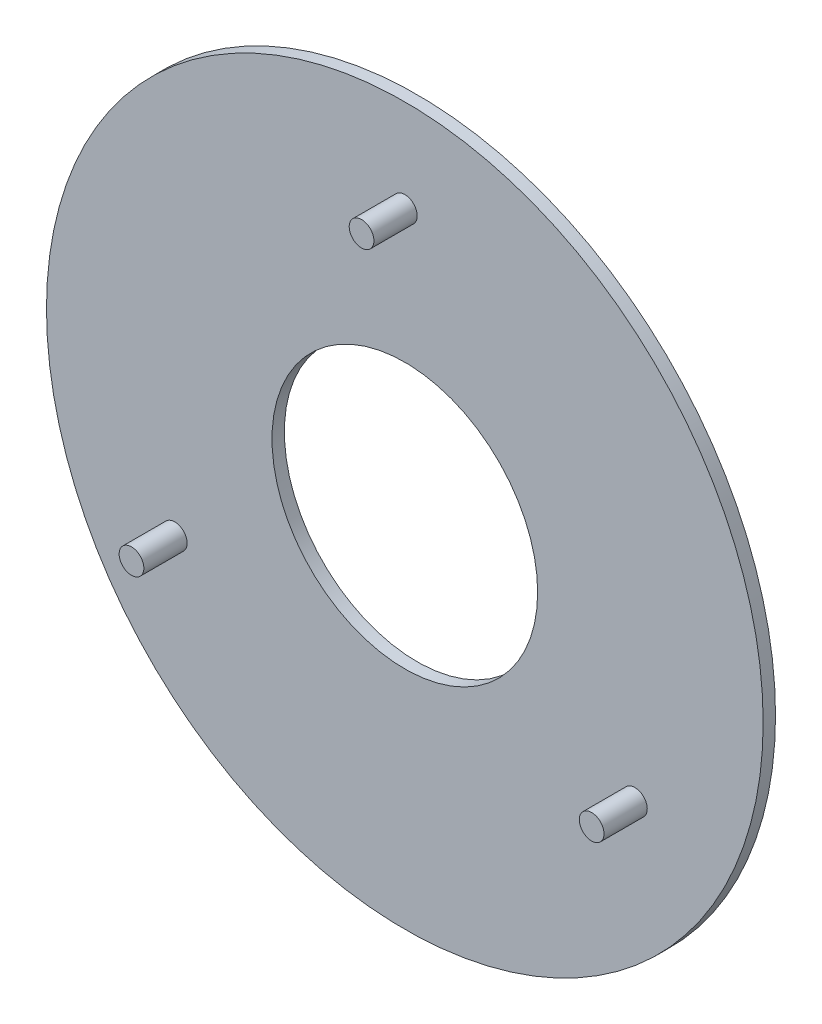
ISO-10303-21;
HEADER;
FILE_DESCRIPTION(('STEP AP214'),'2;1');
FILE_NAME('part.step','',(''),(''),'','','');
FILE_SCHEMA(('AUTOMOTIVE_DESIGN { 1 0 10303 214 1 1 1 1 }'));
ENDSEC;
DATA;
#1=APPLICATION_CONTEXT('core data for automotive mechanical design processes');
#2=APPLICATION_PROTOCOL_DEFINITION('international standard','automotive_design',2000,#1);
#3=PRODUCT_CONTEXT('',#1,'mechanical');
#4=PRODUCT('Part','Part','',(#3));
#5=PRODUCT_RELATED_PRODUCT_CATEGORY('part','',(#4));
#6=PRODUCT_DEFINITION_FORMATION('','',#4);
#7=PRODUCT_DEFINITION_CONTEXT('part definition',#1,'design');
#8=PRODUCT_DEFINITION('design','',#6,#7);
#9=PRODUCT_DEFINITION_SHAPE('','',#8);
#10=(LENGTH_UNIT() NAMED_UNIT(*) SI_UNIT(.MILLI.,.METRE.));
#11=(NAMED_UNIT(*) PLANE_ANGLE_UNIT() SI_UNIT($,.RADIAN.));
#12=(NAMED_UNIT(*) SI_UNIT($,.STERADIAN.) SOLID_ANGLE_UNIT());
#13=UNCERTAINTY_MEASURE_WITH_UNIT(LENGTH_MEASURE(1.E-05),#10,'distance_accuracy_value','');
#14=(GEOMETRIC_REPRESENTATION_CONTEXT(3) GLOBAL_UNCERTAINTY_ASSIGNED_CONTEXT((#13)) GLOBAL_UNIT_ASSIGNED_CONTEXT((#10,
#11,#12)) REPRESENTATION_CONTEXT('',''));
#15=CARTESIAN_POINT('',(0.,0.,0.));
#16=DIRECTION('',(0.,0.,1.));
#17=DIRECTION('',(1.,0.,0.));
#18=AXIS2_PLACEMENT_3D('',#15,#16,#17);
#19=CARTESIAN_POINT('',(0.,0.,-2.));
#20=DIRECTION('',(0.,0.,1.));
#21=DIRECTION('',(1.,0.,0.));
#22=AXIS2_PLACEMENT_3D('',#19,#20,#21);
#23=CYLINDRICAL_SURFACE('',#22,58.);
#24=CARTESIAN_POINT('',(0.,0.,-2.));
#25=DIRECTION('',(0.,0.,1.));
#26=DIRECTION('',(1.,0.,0.));
#27=AXIS2_PLACEMENT_3D('',#24,#25,#26);
#28=CIRCLE('',#27,58.);
#29=CARTESIAN_POINT('',(58.,0.,-2.));
#30=VERTEX_POINT('',#29);
#31=EDGE_CURVE('E10',#30,#30,#28,.T.);
#32=ORIENTED_EDGE('',*,*,#31,.T.);
#33=EDGE_LOOP('',(#32));
#34=FACE_BOUND('',#33,.T.);
#35=CARTESIAN_POINT('',(0.,0.,0.));
#36=DIRECTION('',(0.,0.,1.));
#37=DIRECTION('',(1.,0.,0.));
#38=AXIS2_PLACEMENT_3D('',#35,#36,#37);
#39=CIRCLE('',#38,58.);
#40=CARTESIAN_POINT('',(58.,0.,0.));
#41=VERTEX_POINT('',#40);
#42=EDGE_CURVE('E42',#41,#41,#39,.T.);
#43=ORIENTED_EDGE('',*,*,#42,.F.);
#44=EDGE_LOOP('',(#43));
#45=FACE_BOUND('',#44,.T.);
#46=ADVANCED_FACE('F39',(#34,#45),#23,.T.);
#47=CARTESIAN_POINT('',(0.,0.,-2.));
#48=DIRECTION('',(0.,0.,1.));
#49=DIRECTION('',(1.,0.,0.));
#50=AXIS2_PLACEMENT_3D('',#47,#48,#49);
#51=PLANE('',#50);
#52=CARTESIAN_POINT('',(0.,0.,-2.));
#53=DIRECTION('',(0.,0.,1.));
#54=DIRECTION('',(1.,0.,0.));
#55=AXIS2_PLACEMENT_3D('',#52,#53,#54);
#56=CIRCLE('',#55,21.5);
#57=CARTESIAN_POINT('',(21.5,0.,-2.));
#58=VERTEX_POINT('',#57);
#59=EDGE_CURVE('E66',#58,#58,#56,.T.);
#60=ORIENTED_EDGE('',*,*,#59,.T.);
#61=EDGE_LOOP('',(#60));
#62=FACE_BOUND('',#61,.T.);
#63=ORIENTED_EDGE('',*,*,#31,.F.);
#64=EDGE_LOOP('',(#63));
#65=FACE_BOUND('',#64,.T.);
#66=ADVANCED_FACE('F75',(#62,#65),#51,.F.);
#67=CARTESIAN_POINT('',(0.,0.,0.));
#68=DIRECTION('',(0.,0.,1.));
#69=DIRECTION('',(1.,0.,0.));
#70=AXIS2_PLACEMENT_3D('',#67,#68,#69);
#71=PLANE('',#70);
#72=CARTESIAN_POINT('',(0.,0.,0.));
#73=DIRECTION('',(0.,0.,1.));
#74=DIRECTION('',(1.,0.,0.));
#75=AXIS2_PLACEMENT_3D('',#72,#73,#74);
#76=CIRCLE('',#75,21.5);
#77=CARTESIAN_POINT('',(21.5,0.,0.));
#78=VERTEX_POINT('',#77);
#79=EDGE_CURVE('E69',#78,#78,#76,.T.);
#80=ORIENTED_EDGE('',*,*,#79,.F.);
#81=EDGE_LOOP('',(#80));
#82=FACE_BOUND('',#81,.T.);
#83=CARTESIAN_POINT('',(-37.2390923627311,-21.4999999999997,0.));
#84=DIRECTION('',(0.,0.,1.));
#85=DIRECTION('',(-0.499999999999992,0.866025403784443,0.));
#86=AXIS2_PLACEMENT_3D('',#83,#84,#85);
#87=CIRCLE('',#86,2.);
#88=CARTESIAN_POINT('',(-38.239092362731,-19.7679491924308,0.));
#89=VERTEX_POINT('',#88);
#90=EDGE_CURVE('E63',#89,#89,#87,.T.);
#91=ORIENTED_EDGE('',*,*,#90,.F.);
#92=EDGE_LOOP('',(#91));
#93=FACE_BOUND('',#92,.T.);
#94=CARTESIAN_POINT('',(37.2390923627308,-21.5000000000002,0.));
#95=DIRECTION('',(0.,0.,1.));
#96=DIRECTION('',(-0.500000000000004,-0.866025403784436,0.));
#97=AXIS2_PLACEMENT_3D('',#94,#95,#96);
#98=CIRCLE('',#97,2.);
#99=CARTESIAN_POINT('',(36.2390923627308,-23.232050807569,0.));
#100=VERTEX_POINT('',#99);
#101=EDGE_CURVE('E57',#100,#100,#98,.T.);
#102=ORIENTED_EDGE('',*,*,#101,.F.);
#103=EDGE_LOOP('',(#102));
#104=FACE_BOUND('',#103,.T.);
#105=CARTESIAN_POINT('',(0.,43.,0.));
#106=DIRECTION('',(0.,0.,1.));
#107=DIRECTION('',(1.,0.,0.));
#108=AXIS2_PLACEMENT_3D('',#105,#106,#107);
#109=CIRCLE('',#108,2.);
#110=CARTESIAN_POINT('',(2.,43.,0.));
#111=VERTEX_POINT('',#110);
#112=EDGE_CURVE('E51',#111,#111,#109,.T.);
#113=ORIENTED_EDGE('',*,*,#112,.F.);
#114=EDGE_LOOP('',(#113));
#115=FACE_BOUND('',#114,.T.);
#116=ORIENTED_EDGE('',*,*,#42,.T.);
#117=EDGE_LOOP('',(#116));
#118=FACE_BOUND('',#117,.T.);
#119=ADVANCED_FACE('F85',(#82,#93,#104,#115,#118),#71,.T.);
#120=CARTESIAN_POINT('',(0.,43.,7.));
#121=DIRECTION('',(0.,0.,-1.));
#122=DIRECTION('',(-1.,0.,0.));
#123=AXIS2_PLACEMENT_3D('',#120,#121,#122);
#124=CYLINDRICAL_SURFACE('',#123,2.);
#125=CARTESIAN_POINT('',(0.,43.,7.));
#126=DIRECTION('',(0.,0.,1.));
#127=DIRECTION('',(1.,0.,0.));
#128=AXIS2_PLACEMENT_3D('',#125,#126,#127);
#129=CIRCLE('',#128,2.);
#130=CARTESIAN_POINT('',(2.,43.,7.));
#131=VERTEX_POINT('',#130);
#132=EDGE_CURVE('E49',#131,#131,#129,.T.);
#133=ORIENTED_EDGE('',*,*,#132,.F.);
#134=EDGE_LOOP('',(#133));
#135=FACE_BOUND('',#134,.T.);
#136=ORIENTED_EDGE('',*,*,#112,.T.);
#137=EDGE_LOOP('',(#136));
#138=FACE_BOUND('',#137,.T.);
#139=ADVANCED_FACE('F88',(#135,#138),#124,.T.);
#140=CARTESIAN_POINT('',(0.,43.,7.));
#141=DIRECTION('',(0.,0.,1.));
#142=DIRECTION('',(1.,0.,0.));
#143=AXIS2_PLACEMENT_3D('',#140,#141,#142);
#144=PLANE('',#143);
#145=ORIENTED_EDGE('',*,*,#132,.T.);
#146=EDGE_LOOP('',(#145));
#147=FACE_BOUND('',#146,.T.);
#148=ADVANCED_FACE('F107',(#147),#144,.T.);
#149=CARTESIAN_POINT('',(37.2390923627308,-21.5000000000002,7.));
#150=DIRECTION('',(0.,0.,-1.));
#151=DIRECTION('',(-1.,0.,0.));
#152=AXIS2_PLACEMENT_3D('',#149,#150,#151);
#153=CYLINDRICAL_SURFACE('',#152,2.);
#154=CARTESIAN_POINT('',(37.2390923627308,-21.5000000000002,7.));
#155=DIRECTION('',(0.,0.,1.));
#156=DIRECTION('',(-0.500000000000004,-0.866025403784436,0.));
#157=AXIS2_PLACEMENT_3D('',#154,#155,#156);
#158=CIRCLE('',#157,2.);
#159=CARTESIAN_POINT('',(36.2390923627308,-23.232050807569,7.));
#160=VERTEX_POINT('',#159);
#161=EDGE_CURVE('E54',#160,#160,#158,.T.);
#162=ORIENTED_EDGE('',*,*,#161,.F.);
#163=EDGE_LOOP('',(#162));
#164=FACE_BOUND('',#163,.T.);
#165=ORIENTED_EDGE('',*,*,#101,.T.);
#166=EDGE_LOOP('',(#165));
#167=FACE_BOUND('',#166,.T.);
#168=ADVANCED_FACE('F111',(#164,#167),#153,.T.);
#169=CARTESIAN_POINT('',(37.2390923627308,-21.5000000000002,7.));
#170=DIRECTION('',(0.,0.,1.));
#171=DIRECTION('',(-0.500000000000004,-0.866025403784436,0.));
#172=AXIS2_PLACEMENT_3D('',#169,#170,#171);
#173=PLANE('',#172);
#174=ORIENTED_EDGE('',*,*,#161,.T.);
#175=EDGE_LOOP('',(#174));
#176=FACE_BOUND('',#175,.T.);
#177=ADVANCED_FACE('F115',(#176),#173,.T.);
#178=CARTESIAN_POINT('',(-37.2390923627311,-21.4999999999997,7.));
#179=DIRECTION('',(0.,0.,-1.));
#180=DIRECTION('',(-1.,0.,0.));
#181=AXIS2_PLACEMENT_3D('',#178,#179,#180);
#182=CYLINDRICAL_SURFACE('',#181,2.);
#183=CARTESIAN_POINT('',(-37.2390923627311,-21.4999999999997,7.));
#184=DIRECTION('',(0.,0.,1.));
#185=DIRECTION('',(-0.499999999999992,0.866025403784443,0.));
#186=AXIS2_PLACEMENT_3D('',#183,#184,#185);
#187=CIRCLE('',#186,2.);
#188=CARTESIAN_POINT('',(-38.239092362731,-19.7679491924308,7.));
#189=VERTEX_POINT('',#188);
#190=EDGE_CURVE('E60',#189,#189,#187,.T.);
#191=ORIENTED_EDGE('',*,*,#190,.F.);
#192=EDGE_LOOP('',(#191));
#193=FACE_BOUND('',#192,.T.);
#194=ORIENTED_EDGE('',*,*,#90,.T.);
#195=EDGE_LOOP('',(#194));
#196=FACE_BOUND('',#195,.T.);
#197=ADVANCED_FACE('F119',(#193,#196),#182,.T.);
#198=CARTESIAN_POINT('',(-37.2390923627311,-21.4999999999997,7.));
#199=DIRECTION('',(0.,0.,1.));
#200=DIRECTION('',(-0.499999999999992,0.866025403784443,0.));
#201=AXIS2_PLACEMENT_3D('',#198,#199,#200);
#202=PLANE('',#201);
#203=ORIENTED_EDGE('',*,*,#190,.T.);
#204=EDGE_LOOP('',(#203));
#205=FACE_BOUND('',#204,.T.);
#206=ADVANCED_FACE('F81',(#205),#202,.T.);
#207=CARTESIAN_POINT('',(0.,0.,-2.));
#208=DIRECTION('',(0.,0.,1.));
#209=DIRECTION('',(1.,0.,0.));
#210=AXIS2_PLACEMENT_3D('',#207,#208,#209);
#211=CYLINDRICAL_SURFACE('',#210,21.5);
#212=ORIENTED_EDGE('',*,*,#59,.F.);
#213=EDGE_LOOP('',(#212));
#214=FACE_BOUND('',#213,.T.);
#215=ORIENTED_EDGE('',*,*,#79,.T.);
#216=EDGE_LOOP('',(#215));
#217=FACE_BOUND('',#216,.T.);
#218=ADVANCED_FACE('F78',(#214,#217),#211,.F.);
#219=CLOSED_SHELL('',(#46,#66,#119,#139,#148,#168,#177,#197,#206,#218));
#220=MANIFOLD_SOLID_BREP('B2',#219);
#221=ADVANCED_BREP_SHAPE_REPRESENTATION('',(#18,#220),#14);
#222=SHAPE_DEFINITION_REPRESENTATION(#9,#221);
ENDSEC;
END-ISO-10303-21;
